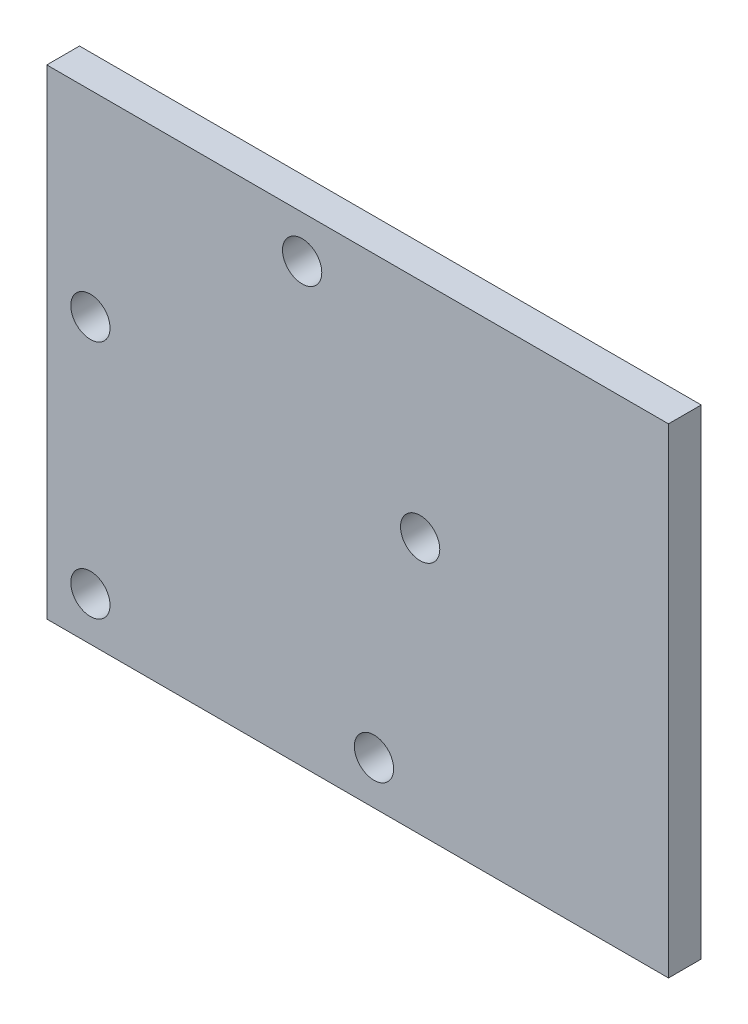
ISO-10303-21;
HEADER;
FILE_DESCRIPTION(('STEP AP214'),'2;1');
FILE_NAME('part.step','',(''),(''),'','','');
FILE_SCHEMA(('AUTOMOTIVE_DESIGN { 1 0 10303 214 1 1 1 1 }'));
ENDSEC;
DATA;
#1=APPLICATION_CONTEXT('core data for automotive mechanical design processes');
#2=APPLICATION_PROTOCOL_DEFINITION('international standard','automotive_design',2000,#1);
#3=PRODUCT_CONTEXT('',#1,'mechanical');
#4=PRODUCT('Part','Part','',(#3));
#5=PRODUCT_RELATED_PRODUCT_CATEGORY('part','',(#4));
#6=PRODUCT_DEFINITION_FORMATION('','',#4);
#7=PRODUCT_DEFINITION_CONTEXT('part definition',#1,'design');
#8=PRODUCT_DEFINITION('design','',#6,#7);
#9=PRODUCT_DEFINITION_SHAPE('','',#8);
#10=(LENGTH_UNIT() NAMED_UNIT(*) SI_UNIT(.MILLI.,.METRE.));
#11=(NAMED_UNIT(*) PLANE_ANGLE_UNIT() SI_UNIT($,.RADIAN.));
#12=(NAMED_UNIT(*) SI_UNIT($,.STERADIAN.) SOLID_ANGLE_UNIT());
#13=UNCERTAINTY_MEASURE_WITH_UNIT(LENGTH_MEASURE(1.E-05),#10,'distance_accuracy_value','');
#14=(GEOMETRIC_REPRESENTATION_CONTEXT(3) GLOBAL_UNCERTAINTY_ASSIGNED_CONTEXT((#13)) GLOBAL_UNIT_ASSIGNED_CONTEXT((#10,
#11,#12)) REPRESENTATION_CONTEXT('',''));
#15=CARTESIAN_POINT('',(0.,0.,0.));
#16=DIRECTION('',(0.,0.,1.));
#17=DIRECTION('',(1.,0.,0.));
#18=AXIS2_PLACEMENT_3D('',#15,#16,#17);
#19=CARTESIAN_POINT('',(0.,0.,3.));
#20=DIRECTION('',(0.,0.,-1.));
#21=DIRECTION('',(-1.,0.,0.));
#22=AXIS2_PLACEMENT_3D('',#19,#20,#21);
#23=PLANE('',#22);
#24=DIRECTION('',(0.,-1.,0.));
#25=VECTOR('',#24,1.);
#26=CARTESIAN_POINT('',(0.,0.,3.));
#27=LINE('',#26,#25);
#28=CARTESIAN_POINT('',(0.,44.,3.));
#29=VERTEX_POINT('',#28);
#30=CARTESIAN_POINT('',(0.,0.,3.));
#31=VERTEX_POINT('',#30);
#32=EDGE_CURVE('E85',#29,#31,#27,.T.);
#33=ORIENTED_EDGE('',*,*,#32,.T.);
#34=DIRECTION('',(1.,0.,0.));
#35=VECTOR('',#34,1.);
#36=CARTESIAN_POINT('',(0.,0.,3.));
#37=LINE('',#36,#35);
#38=CARTESIAN_POINT('',(57.,0.,3.));
#39=VERTEX_POINT('',#38);
#40=EDGE_CURVE('E80',#31,#39,#37,.T.);
#41=ORIENTED_EDGE('',*,*,#40,.T.);
#42=DIRECTION('',(0.,1.,0.));
#43=VECTOR('',#42,1.);
#44=CARTESIAN_POINT('',(57.,0.,3.));
#45=LINE('',#44,#43);
#46=CARTESIAN_POINT('',(57.,44.,3.));
#47=VERTEX_POINT('',#46);
#48=EDGE_CURVE('E83',#39,#47,#45,.T.);
#49=ORIENTED_EDGE('',*,*,#48,.T.);
#50=DIRECTION('',(-1.,0.,0.));
#51=VECTOR('',#50,1.);
#52=CARTESIAN_POINT('',(0.,44.,3.));
#53=LINE('',#52,#51);
#54=EDGE_CURVE('E50',#47,#29,#53,.T.);
#55=ORIENTED_EDGE('',*,*,#54,.T.);
#56=EDGE_LOOP('',(#33,#41,#49,#55));
#57=FACE_BOUND('',#56,.T.);
#58=CARTESIAN_POINT('',(4.00000000000001,4.,3.));
#59=DIRECTION('',(0.,0.,1.));
#60=DIRECTION('',(1.,0.,0.));
#61=AXIS2_PLACEMENT_3D('',#58,#59,#60);
#62=CIRCLE('',#61,1.8);
#63=CARTESIAN_POINT('',(5.80000000000001,4.,3.));
#64=VERTEX_POINT('',#63);
#65=EDGE_CURVE('E100',#64,#64,#62,.T.);
#66=ORIENTED_EDGE('',*,*,#65,.F.);
#67=EDGE_LOOP('',(#66));
#68=FACE_BOUND('',#67,.T.);
#69=CARTESIAN_POINT('',(30.,4.,3.));
#70=DIRECTION('',(0.,0.,1.));
#71=DIRECTION('',(1.,0.,0.));
#72=AXIS2_PLACEMENT_3D('',#69,#70,#71);
#73=CIRCLE('',#72,1.8);
#74=CARTESIAN_POINT('',(31.8,4.,3.));
#75=VERTEX_POINT('',#74);
#76=EDGE_CURVE('E115',#75,#75,#73,.T.);
#77=ORIENTED_EDGE('',*,*,#76,.F.);
#78=EDGE_LOOP('',(#77));
#79=FACE_BOUND('',#78,.T.);
#80=CARTESIAN_POINT('',(4.00000000000001,26.,3.));
#81=DIRECTION('',(0.,0.,1.));
#82=DIRECTION('',(1.,0.,0.));
#83=AXIS2_PLACEMENT_3D('',#80,#81,#82);
#84=CIRCLE('',#83,1.8);
#85=CARTESIAN_POINT('',(5.80000000000001,26.,3.));
#86=VERTEX_POINT('',#85);
#87=EDGE_CURVE('E121',#86,#86,#84,.T.);
#88=ORIENTED_EDGE('',*,*,#87,.F.);
#89=EDGE_LOOP('',(#88));
#90=FACE_BOUND('',#89,.T.);
#91=CARTESIAN_POINT('',(34.2307692307692,23.5473934762662,3.));
#92=DIRECTION('',(0.,0.,1.));
#93=DIRECTION('',(1.,0.,0.));
#94=AXIS2_PLACEMENT_3D('',#91,#92,#93);
#95=CIRCLE('',#94,1.8);
#96=CARTESIAN_POINT('',(36.0307692307692,23.5473934762662,3.));
#97=VERTEX_POINT('',#96);
#98=EDGE_CURVE('E127',#97,#97,#95,.T.);
#99=ORIENTED_EDGE('',*,*,#98,.F.);
#100=EDGE_LOOP('',(#99));
#101=FACE_BOUND('',#100,.T.);
#102=CARTESIAN_POINT('',(23.4114726024339,40.1136363636364,3.));
#103=DIRECTION('',(0.,0.,1.));
#104=DIRECTION('',(1.,0.,0.));
#105=AXIS2_PLACEMENT_3D('',#102,#103,#104);
#106=CIRCLE('',#105,1.80000000000001);
#107=CARTESIAN_POINT('',(25.2114726024339,40.1136363636364,3.));
#108=VERTEX_POINT('',#107);
#109=EDGE_CURVE('E133',#108,#108,#106,.T.);
#110=ORIENTED_EDGE('',*,*,#109,.F.);
#111=EDGE_LOOP('',(#110));
#112=FACE_BOUND('',#111,.T.);
#113=ADVANCED_FACE('F33',(#57,#68,#79,#90,#101,#112),#23,.F.);
#114=CARTESIAN_POINT('',(0.,0.,0.));
#115=DIRECTION('',(0.,0.,-1.));
#116=DIRECTION('',(-1.,0.,0.));
#117=AXIS2_PLACEMENT_3D('',#114,#115,#116);
#118=PLANE('',#117);
#119=CARTESIAN_POINT('',(34.2307692307692,23.5473934762662,0.));
#120=DIRECTION('',(0.,0.,1.));
#121=DIRECTION('',(1.,0.,0.));
#122=AXIS2_PLACEMENT_3D('',#119,#120,#121);
#123=CIRCLE('',#122,1.8);
#124=CARTESIAN_POINT('',(36.0307692307692,23.5473934762662,0.));
#125=VERTEX_POINT('',#124);
#126=EDGE_CURVE('E130',#125,#125,#123,.T.);
#127=ORIENTED_EDGE('',*,*,#126,.T.);
#128=EDGE_LOOP('',(#127));
#129=FACE_BOUND('',#128,.T.);
#130=CARTESIAN_POINT('',(30.,4.,0.));
#131=DIRECTION('',(0.,0.,1.));
#132=DIRECTION('',(1.,0.,0.));
#133=AXIS2_PLACEMENT_3D('',#130,#131,#132);
#134=CIRCLE('',#133,1.8);
#135=CARTESIAN_POINT('',(31.8,4.,0.));
#136=VERTEX_POINT('',#135);
#137=EDGE_CURVE('E118',#136,#136,#134,.T.);
#138=ORIENTED_EDGE('',*,*,#137,.T.);
#139=EDGE_LOOP('',(#138));
#140=FACE_BOUND('',#139,.T.);
#141=DIRECTION('',(0.,-1.,0.));
#142=VECTOR('',#141,1.);
#143=CARTESIAN_POINT('',(0.,0.,0.));
#144=LINE('',#143,#142);
#145=CARTESIAN_POINT('',(0.,44.,0.));
#146=VERTEX_POINT('',#145);
#147=CARTESIAN_POINT('',(0.,0.,0.));
#148=VERTEX_POINT('',#147);
#149=EDGE_CURVE('E97',#146,#148,#144,.T.);
#150=ORIENTED_EDGE('',*,*,#149,.F.);
#151=DIRECTION('',(-1.,0.,0.));
#152=VECTOR('',#151,1.);
#153=CARTESIAN_POINT('',(0.,44.,0.));
#154=LINE('',#153,#152);
#155=CARTESIAN_POINT('',(57.,44.,0.));
#156=VERTEX_POINT('',#155);
#157=EDGE_CURVE('E73',#156,#146,#154,.T.);
#158=ORIENTED_EDGE('',*,*,#157,.F.);
#159=DIRECTION('',(0.,1.,0.));
#160=VECTOR('',#159,1.);
#161=CARTESIAN_POINT('',(57.,0.,0.));
#162=LINE('',#161,#160);
#163=CARTESIAN_POINT('',(57.,0.,0.));
#164=VERTEX_POINT('',#163);
#165=EDGE_CURVE('E67',#164,#156,#162,.T.);
#166=ORIENTED_EDGE('',*,*,#165,.F.);
#167=DIRECTION('',(1.,0.,0.));
#168=VECTOR('',#167,1.);
#169=CARTESIAN_POINT('',(0.,0.,0.));
#170=LINE('',#169,#168);
#171=EDGE_CURVE('E89',#148,#164,#170,.T.);
#172=ORIENTED_EDGE('',*,*,#171,.F.);
#173=EDGE_LOOP('',(#150,#158,#166,#172));
#174=FACE_BOUND('',#173,.T.);
#175=CARTESIAN_POINT('',(4.00000000000001,4.,0.));
#176=DIRECTION('',(0.,0.,1.));
#177=DIRECTION('',(1.,0.,0.));
#178=AXIS2_PLACEMENT_3D('',#175,#176,#177);
#179=CIRCLE('',#178,1.8);
#180=CARTESIAN_POINT('',(5.80000000000001,4.,0.));
#181=VERTEX_POINT('',#180);
#182=EDGE_CURVE('E112',#181,#181,#179,.T.);
#183=ORIENTED_EDGE('',*,*,#182,.T.);
#184=EDGE_LOOP('',(#183));
#185=FACE_BOUND('',#184,.T.);
#186=CARTESIAN_POINT('',(4.00000000000001,26.,0.));
#187=DIRECTION('',(0.,0.,1.));
#188=DIRECTION('',(1.,0.,0.));
#189=AXIS2_PLACEMENT_3D('',#186,#187,#188);
#190=CIRCLE('',#189,1.8);
#191=CARTESIAN_POINT('',(5.80000000000001,26.,0.));
#192=VERTEX_POINT('',#191);
#193=EDGE_CURVE('E124',#192,#192,#190,.T.);
#194=ORIENTED_EDGE('',*,*,#193,.T.);
#195=EDGE_LOOP('',(#194));
#196=FACE_BOUND('',#195,.T.);
#197=CARTESIAN_POINT('',(23.4114726024339,40.1136363636364,0.));
#198=DIRECTION('',(0.,0.,1.));
#199=DIRECTION('',(1.,0.,0.));
#200=AXIS2_PLACEMENT_3D('',#197,#198,#199);
#201=CIRCLE('',#200,1.80000000000001);
#202=CARTESIAN_POINT('',(25.2114726024339,40.1136363636364,0.));
#203=VERTEX_POINT('',#202);
#204=EDGE_CURVE('E136',#203,#203,#201,.T.);
#205=ORIENTED_EDGE('',*,*,#204,.T.);
#206=EDGE_LOOP('',(#205));
#207=FACE_BOUND('',#206,.T.);
#208=ADVANCED_FACE('F108',(#129,#140,#174,#185,#196,#207),#118,.T.);
#209=CARTESIAN_POINT('',(0.,0.,3.));
#210=DIRECTION('',(1.,0.,0.));
#211=DIRECTION('',(0.,0.,-1.));
#212=AXIS2_PLACEMENT_3D('',#209,#210,#211);
#213=PLANE('',#212);
#214=ORIENTED_EDGE('',*,*,#149,.T.);
#215=DIRECTION('',(0.,0.,-1.));
#216=VECTOR('',#215,1.);
#217=CARTESIAN_POINT('',(0.,0.,3.));
#218=LINE('',#217,#216);
#219=EDGE_CURVE('E11',#31,#148,#218,.T.);
#220=ORIENTED_EDGE('',*,*,#219,.F.);
#221=ORIENTED_EDGE('',*,*,#32,.F.);
#222=DIRECTION('',(0.,0.,-1.));
#223=VECTOR('',#222,1.);
#224=CARTESIAN_POINT('',(0.,44.,3.));
#225=LINE('',#224,#223);
#226=EDGE_CURVE('E93',#29,#146,#225,.T.);
#227=ORIENTED_EDGE('',*,*,#226,.T.);
#228=EDGE_LOOP('',(#214,#220,#221,#227));
#229=FACE_BOUND('',#228,.T.);
#230=ADVANCED_FACE('F35',(#229),#213,.F.);
#231=CARTESIAN_POINT('',(0.,0.,3.));
#232=DIRECTION('',(0.,1.,0.));
#233=DIRECTION('',(0.,0.,1.));
#234=AXIS2_PLACEMENT_3D('',#231,#232,#233);
#235=PLANE('',#234);
#236=ORIENTED_EDGE('',*,*,#171,.T.);
#237=DIRECTION('',(0.,0.,-1.));
#238=VECTOR('',#237,1.);
#239=CARTESIAN_POINT('',(57.,0.,3.));
#240=LINE('',#239,#238);
#241=EDGE_CURVE('E42',#39,#164,#240,.T.);
#242=ORIENTED_EDGE('',*,*,#241,.F.);
#243=ORIENTED_EDGE('',*,*,#40,.F.);
#244=ORIENTED_EDGE('',*,*,#219,.T.);
#245=EDGE_LOOP('',(#236,#242,#243,#244));
#246=FACE_BOUND('',#245,.T.);
#247=ADVANCED_FACE('F88',(#246),#235,.F.);
#248=CARTESIAN_POINT('',(57.,0.,3.));
#249=DIRECTION('',(-1.,0.,0.));
#250=DIRECTION('',(0.,0.,1.));
#251=AXIS2_PLACEMENT_3D('',#248,#249,#250);
#252=PLANE('',#251);
#253=ORIENTED_EDGE('',*,*,#165,.T.);
#254=DIRECTION('',(0.,0.,-1.));
#255=VECTOR('',#254,1.);
#256=CARTESIAN_POINT('',(57.,44.,3.));
#257=LINE('',#256,#255);
#258=EDGE_CURVE('E90',#47,#156,#257,.T.);
#259=ORIENTED_EDGE('',*,*,#258,.F.);
#260=ORIENTED_EDGE('',*,*,#48,.F.);
#261=ORIENTED_EDGE('',*,*,#241,.T.);
#262=EDGE_LOOP('',(#253,#259,#260,#261));
#263=FACE_BOUND('',#262,.T.);
#264=ADVANCED_FACE('F91',(#263),#252,.F.);
#265=CARTESIAN_POINT('',(0.,44.,3.));
#266=DIRECTION('',(0.,-1.,0.));
#267=DIRECTION('',(0.,0.,-1.));
#268=AXIS2_PLACEMENT_3D('',#265,#266,#267);
#269=PLANE('',#268);
#270=ORIENTED_EDGE('',*,*,#157,.T.);
#271=ORIENTED_EDGE('',*,*,#226,.F.);
#272=ORIENTED_EDGE('',*,*,#54,.F.);
#273=ORIENTED_EDGE('',*,*,#258,.T.);
#274=EDGE_LOOP('',(#270,#271,#272,#273));
#275=FACE_BOUND('',#274,.T.);
#276=ADVANCED_FACE('F105',(#275),#269,.F.);
#277=CARTESIAN_POINT('',(4.00000000000001,4.,3.));
#278=DIRECTION('',(0.,0.,-1.));
#279=DIRECTION('',(-1.,0.,0.));
#280=AXIS2_PLACEMENT_3D('',#277,#278,#279);
#281=CYLINDRICAL_SURFACE('',#280,1.8);
#282=ORIENTED_EDGE('',*,*,#65,.T.);
#283=EDGE_LOOP('',(#282));
#284=FACE_BOUND('',#283,.T.);
#285=ORIENTED_EDGE('',*,*,#182,.F.);
#286=EDGE_LOOP('',(#285));
#287=FACE_BOUND('',#286,.T.);
#288=ADVANCED_FACE('F153',(#284,#287),#281,.F.);
#289=CARTESIAN_POINT('',(30.,4.,3.));
#290=DIRECTION('',(0.,0.,-1.));
#291=DIRECTION('',(-1.,0.,0.));
#292=AXIS2_PLACEMENT_3D('',#289,#290,#291);
#293=CYLINDRICAL_SURFACE('',#292,1.8);
#294=ORIENTED_EDGE('',*,*,#76,.T.);
#295=EDGE_LOOP('',(#294));
#296=FACE_BOUND('',#295,.T.);
#297=ORIENTED_EDGE('',*,*,#137,.F.);
#298=EDGE_LOOP('',(#297));
#299=FACE_BOUND('',#298,.T.);
#300=ADVANCED_FACE('F199',(#296,#299),#293,.F.);
#301=CARTESIAN_POINT('',(4.00000000000001,26.,3.));
#302=DIRECTION('',(0.,0.,-1.));
#303=DIRECTION('',(-1.,0.,0.));
#304=AXIS2_PLACEMENT_3D('',#301,#302,#303);
#305=CYLINDRICAL_SURFACE('',#304,1.8);
#306=ORIENTED_EDGE('',*,*,#87,.T.);
#307=EDGE_LOOP('',(#306));
#308=FACE_BOUND('',#307,.T.);
#309=ORIENTED_EDGE('',*,*,#193,.F.);
#310=EDGE_LOOP('',(#309));
#311=FACE_BOUND('',#310,.T.);
#312=ADVANCED_FACE('F207',(#308,#311),#305,.F.);
#313=CARTESIAN_POINT('',(34.2307692307692,23.5473934762662,3.));
#314=DIRECTION('',(0.,0.,-1.));
#315=DIRECTION('',(-1.,0.,0.));
#316=AXIS2_PLACEMENT_3D('',#313,#314,#315);
#317=CYLINDRICAL_SURFACE('',#316,1.8);
#318=ORIENTED_EDGE('',*,*,#98,.T.);
#319=EDGE_LOOP('',(#318));
#320=FACE_BOUND('',#319,.T.);
#321=ORIENTED_EDGE('',*,*,#126,.F.);
#322=EDGE_LOOP('',(#321));
#323=FACE_BOUND('',#322,.T.);
#324=ADVANCED_FACE('F215',(#320,#323),#317,.F.);
#325=CARTESIAN_POINT('',(23.4114726024339,40.1136363636364,3.));
#326=DIRECTION('',(0.,0.,-1.));
#327=DIRECTION('',(-1.,0.,0.));
#328=AXIS2_PLACEMENT_3D('',#325,#326,#327);
#329=CYLINDRICAL_SURFACE('',#328,1.80000000000001);
#330=ORIENTED_EDGE('',*,*,#109,.T.);
#331=EDGE_LOOP('',(#330));
#332=FACE_BOUND('',#331,.T.);
#333=ORIENTED_EDGE('',*,*,#204,.F.);
#334=EDGE_LOOP('',(#333));
#335=FACE_BOUND('',#334,.T.);
#336=ADVANCED_FACE('F142',(#332,#335),#329,.F.);
#337=CLOSED_SHELL('',(#113,#208,#230,#247,#264,#276,#288,#300,#312,#324,#336));
#338=MANIFOLD_SOLID_BREP('B2',#337);
#339=ADVANCED_BREP_SHAPE_REPRESENTATION('',(#18,#338),#14);
#340=SHAPE_DEFINITION_REPRESENTATION(#9,#339);
ENDSEC;
END-ISO-10303-21;
